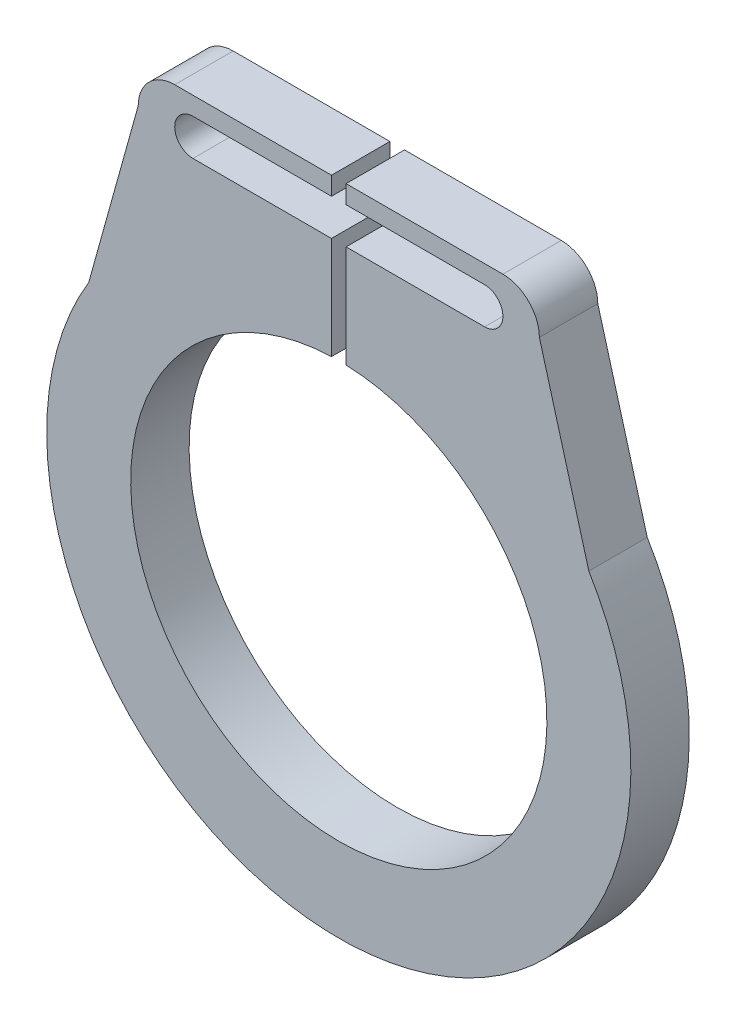
ISO-10303-21;
HEADER;
FILE_DESCRIPTION(('STEP AP214'),'2;1');
FILE_NAME('part.step','',(''),(''),'','','');
FILE_SCHEMA(('AUTOMOTIVE_DESIGN { 1 0 10303 214 1 1 1 1 }'));
ENDSEC;
DATA;
#1=APPLICATION_CONTEXT('core data for automotive mechanical design processes');
#2=APPLICATION_PROTOCOL_DEFINITION('international standard','automotive_design',2000,#1);
#3=PRODUCT_CONTEXT('',#1,'mechanical');
#4=PRODUCT('Part','Part','',(#3));
#5=PRODUCT_RELATED_PRODUCT_CATEGORY('part','',(#4));
#6=PRODUCT_DEFINITION_FORMATION('','',#4);
#7=PRODUCT_DEFINITION_CONTEXT('part definition',#1,'design');
#8=PRODUCT_DEFINITION('design','',#6,#7);
#9=PRODUCT_DEFINITION_SHAPE('','',#8);
#10=(LENGTH_UNIT() NAMED_UNIT(*) SI_UNIT(.MILLI.,.METRE.));
#11=(NAMED_UNIT(*) PLANE_ANGLE_UNIT() SI_UNIT($,.RADIAN.));
#12=(NAMED_UNIT(*) SI_UNIT($,.STERADIAN.) SOLID_ANGLE_UNIT());
#13=UNCERTAINTY_MEASURE_WITH_UNIT(LENGTH_MEASURE(1.E-05),#10,'distance_accuracy_value','');
#14=(GEOMETRIC_REPRESENTATION_CONTEXT(3) GLOBAL_UNCERTAINTY_ASSIGNED_CONTEXT((#13)) GLOBAL_UNIT_ASSIGNED_CONTEXT((#10,
#11,#12)) REPRESENTATION_CONTEXT('',''));
#15=CARTESIAN_POINT('',(0.,0.,0.));
#16=DIRECTION('',(0.,0.,1.));
#17=DIRECTION('',(1.,0.,0.));
#18=AXIS2_PLACEMENT_3D('',#15,#16,#17);
#19=CARTESIAN_POINT('',(-1.85610436769027,0.516802971761623,0.4));
#20=DIRECTION('',(0.9633546511255,-0.268230900820293,0.));
#21=DIRECTION('',(0.268230900820293,0.9633546511255,0.));
#22=AXIS2_PLACEMENT_3D('',#19,#20,#21);
#23=PLANE('',#22);
#24=DIRECTION('',(-0.268230900820293,-0.9633546511255,0.));
#25=VECTOR('',#24,1.);
#26=CARTESIAN_POINT('',(-1.85610436769027,0.516802971761623,0.));
#27=LINE('',#26,#25);
#28=CARTESIAN_POINT('',(-1.37352300511493,2.25,0.));
#29=VERTEX_POINT('',#28);
#30=CARTESIAN_POINT('',(-1.71220873538054,1.03360594352325,0.));
#31=VERTEX_POINT('',#30);
#32=EDGE_CURVE('E192',#29,#31,#27,.T.);
#33=ORIENTED_EDGE('',*,*,#32,.T.);
#34=DIRECTION('',(0.,0.,-1.));
#35=VECTOR('',#34,1.);
#36=CARTESIAN_POINT('',(-1.71220873538054,1.03360594352325,0.4));
#37=LINE('',#36,#35);
#38=CARTESIAN_POINT('',(-1.71220873538054,1.03360594352325,0.4));
#39=VERTEX_POINT('',#38);
#40=EDGE_CURVE('E11',#39,#31,#37,.T.);
#41=ORIENTED_EDGE('',*,*,#40,.F.);
#42=DIRECTION('',(-0.268230900820293,-0.9633546511255,0.));
#43=VECTOR('',#42,1.);
#44=CARTESIAN_POINT('',(-1.85610436769027,0.516802971761623,0.4));
#45=LINE('',#44,#43);
#46=CARTESIAN_POINT('',(-1.37352300511493,2.25,0.4));
#47=VERTEX_POINT('',#46);
#48=EDGE_CURVE('E235',#47,#39,#45,.T.);
#49=ORIENTED_EDGE('',*,*,#48,.F.);
#50=DIRECTION('',(0.,0.,-1.));
#51=VECTOR('',#50,1.);
#52=CARTESIAN_POINT('',(-1.37352300511493,2.25,0.4));
#53=LINE('',#52,#51);
#54=EDGE_CURVE('E187',#47,#29,#53,.T.);
#55=ORIENTED_EDGE('',*,*,#54,.T.);
#56=EDGE_LOOP('',(#33,#41,#49,#55));
#57=FACE_BOUND('',#56,.T.);
#58=ADVANCED_FACE('F35',(#57),#23,.F.);
#59=CARTESIAN_POINT('',(0.,0.,0.4));
#60=DIRECTION('',(0.,0.,-1.));
#61=DIRECTION('',(-1.,0.,0.));
#62=AXIS2_PLACEMENT_3D('',#59,#60,#61);
#63=CYLINDRICAL_SURFACE('',#62,2.);
#64=CARTESIAN_POINT('',(0.,0.,0.));
#65=DIRECTION('',(0.,0.,1.));
#66=DIRECTION('',(1.,0.,0.));
#67=AXIS2_PLACEMENT_3D('',#64,#65,#66);
#68=CIRCLE('',#67,2.);
#69=CARTESIAN_POINT('',(1.71220873538054,1.03360594352325,0.));
#70=VERTEX_POINT('',#69);
#71=EDGE_CURVE('E195',#31,#70,#68,.T.);
#72=ORIENTED_EDGE('',*,*,#71,.T.);
#73=DIRECTION('',(0.,0.,-1.));
#74=VECTOR('',#73,1.);
#75=CARTESIAN_POINT('',(1.71220873538054,1.03360594352325,0.4));
#76=LINE('',#75,#74);
#77=CARTESIAN_POINT('',(1.71220873538054,1.03360594352325,0.4));
#78=VERTEX_POINT('',#77);
#79=EDGE_CURVE('E43',#78,#70,#76,.T.);
#80=ORIENTED_EDGE('',*,*,#79,.F.);
#81=CARTESIAN_POINT('',(0.,0.,0.4));
#82=DIRECTION('',(0.,0.,1.));
#83=DIRECTION('',(1.,0.,0.));
#84=AXIS2_PLACEMENT_3D('',#81,#82,#83);
#85=CIRCLE('',#84,2.);
#86=EDGE_CURVE('E120',#39,#78,#85,.T.);
#87=ORIENTED_EDGE('',*,*,#86,.F.);
#88=ORIENTED_EDGE('',*,*,#40,.T.);
#89=EDGE_LOOP('',(#72,#80,#87,#88));
#90=FACE_BOUND('',#89,.T.);
#91=ADVANCED_FACE('F326',(#90),#63,.T.);
#92=CARTESIAN_POINT('',(1.85610436769027,0.516802971761623,0.4));
#93=DIRECTION('',(-0.9633546511255,-0.268230900820293,0.));
#94=DIRECTION('',(0.268230900820293,-0.9633546511255,0.));
#95=AXIS2_PLACEMENT_3D('',#92,#93,#94);
#96=PLANE('',#95);
#97=DIRECTION('',(-0.268230900820293,0.9633546511255,0.));
#98=VECTOR('',#97,1.);
#99=CARTESIAN_POINT('',(1.85610436769027,0.516802971761623,0.));
#100=LINE('',#99,#98);
#101=CARTESIAN_POINT('',(1.37352300511493,2.25,0.));
#102=VERTEX_POINT('',#101);
#103=EDGE_CURVE('E197',#70,#102,#100,.T.);
#104=ORIENTED_EDGE('',*,*,#103,.T.);
#105=DIRECTION('',(0.,0.,-1.));
#106=VECTOR('',#105,1.);
#107=CARTESIAN_POINT('',(1.37352300511493,2.25,0.4));
#108=LINE('',#107,#106);
#109=CARTESIAN_POINT('',(1.37352300511493,2.25,0.4));
#110=VERTEX_POINT('',#109);
#111=EDGE_CURVE('E262',#110,#102,#108,.T.);
#112=ORIENTED_EDGE('',*,*,#111,.F.);
#113=DIRECTION('',(-0.268230900820293,0.9633546511255,0.));
#114=VECTOR('',#113,1.);
#115=CARTESIAN_POINT('',(1.85610436769027,0.516802971761623,0.4));
#116=LINE('',#115,#114);
#117=EDGE_CURVE('E270',#78,#110,#116,.T.);
#118=ORIENTED_EDGE('',*,*,#117,.F.);
#119=ORIENTED_EDGE('',*,*,#79,.T.);
#120=EDGE_LOOP('',(#104,#112,#118,#119));
#121=FACE_BOUND('',#120,.T.);
#122=ADVANCED_FACE('F268',(#121),#96,.F.);
#123=CARTESIAN_POINT('',(1.12352300511493,2.25,0.4));
#124=DIRECTION('',(0.,0.,-1.));
#125=DIRECTION('',(-1.,0.,0.));
#126=AXIS2_PLACEMENT_3D('',#123,#124,#125);
#127=CYLINDRICAL_SURFACE('',#126,0.25);
#128=CARTESIAN_POINT('',(1.12352300511493,2.25,0.));
#129=DIRECTION('',(0.,0.,1.));
#130=DIRECTION('',(1.,0.,0.));
#131=AXIS2_PLACEMENT_3D('',#128,#129,#130);
#132=CIRCLE('',#131,0.25);
#133=CARTESIAN_POINT('',(1.12352300511493,2.5,0.));
#134=VERTEX_POINT('',#133);
#135=EDGE_CURVE('E199',#102,#134,#132,.T.);
#136=ORIENTED_EDGE('',*,*,#135,.T.);
#137=DIRECTION('',(0.,0.,-1.));
#138=VECTOR('',#137,1.);
#139=CARTESIAN_POINT('',(1.12352300511493,2.5,0.4));
#140=LINE('',#139,#138);
#141=CARTESIAN_POINT('',(1.12352300511493,2.5,0.4));
#142=VERTEX_POINT('',#141);
#143=EDGE_CURVE('E260',#142,#134,#140,.T.);
#144=ORIENTED_EDGE('',*,*,#143,.F.);
#145=CARTESIAN_POINT('',(1.12352300511493,2.25,0.4));
#146=DIRECTION('',(0.,0.,1.));
#147=DIRECTION('',(1.,0.,0.));
#148=AXIS2_PLACEMENT_3D('',#145,#146,#147);
#149=CIRCLE('',#148,0.25);
#150=EDGE_CURVE('E281',#110,#142,#149,.T.);
#151=ORIENTED_EDGE('',*,*,#150,.F.);
#152=ORIENTED_EDGE('',*,*,#111,.T.);
#153=EDGE_LOOP('',(#136,#144,#151,#152));
#154=FACE_BOUND('',#153,.T.);
#155=ADVANCED_FACE('F278',(#154),#127,.T.);
#156=CARTESIAN_POINT('',(0.,2.5,0.4));
#157=DIRECTION('',(0.,1.,0.));
#158=DIRECTION('',(-1.,0.,0.));
#159=AXIS2_PLACEMENT_3D('',#156,#157,#158);
#160=PLANE('',#159);
#161=DIRECTION('',(1.,0.,0.));
#162=VECTOR('',#161,1.);
#163=CARTESIAN_POINT('',(0.,2.5,0.));
#164=LINE('',#163,#162);
#165=CARTESIAN_POINT('',(0.05,2.5,0.));
#166=VERTEX_POINT('',#165);
#167=EDGE_CURVE('E202',#166,#134,#164,.T.);
#168=ORIENTED_EDGE('',*,*,#167,.F.);
#169=DIRECTION('',(0.,0.,-1.));
#170=VECTOR('',#169,1.);
#171=CARTESIAN_POINT('',(0.05,2.5,0.4));
#172=LINE('',#171,#170);
#173=CARTESIAN_POINT('',(0.05,2.5,0.4));
#174=VERTEX_POINT('',#173);
#175=EDGE_CURVE('E258',#174,#166,#172,.T.);
#176=ORIENTED_EDGE('',*,*,#175,.F.);
#177=DIRECTION('',(1.,0.,0.));
#178=VECTOR('',#177,1.);
#179=CARTESIAN_POINT('',(0.,2.5,0.4));
#180=LINE('',#179,#178);
#181=EDGE_CURVE('E283',#174,#142,#180,.T.);
#182=ORIENTED_EDGE('',*,*,#181,.T.);
#183=ORIENTED_EDGE('',*,*,#143,.T.);
#184=EDGE_LOOP('',(#168,#176,#182,#183));
#185=FACE_BOUND('',#184,.T.);
#186=ADVANCED_FACE('F337',(#185),#160,.T.);
#187=CARTESIAN_POINT('',(0.0500000000000001,0.,0.4));
#188=DIRECTION('',(-1.,0.,0.));
#189=DIRECTION('',(0.,-1.,0.));
#190=AXIS2_PLACEMENT_3D('',#187,#188,#189);
#191=PLANE('',#190);
#192=DIRECTION('',(0.,1.,0.));
#193=VECTOR('',#192,1.);
#194=CARTESIAN_POINT('',(0.0500000000000001,0.,0.));
#195=LINE('',#194,#193);
#196=CARTESIAN_POINT('',(0.05,2.375,0.));
#197=VERTEX_POINT('',#196);
#198=EDGE_CURVE('E205',#197,#166,#195,.T.);
#199=ORIENTED_EDGE('',*,*,#198,.F.);
#200=DIRECTION('',(0.,0.,-1.));
#201=VECTOR('',#200,1.);
#202=CARTESIAN_POINT('',(0.05,2.375,0.4));
#203=LINE('',#202,#201);
#204=CARTESIAN_POINT('',(0.05,2.375,0.4));
#205=VERTEX_POINT('',#204);
#206=EDGE_CURVE('E256',#205,#197,#203,.T.);
#207=ORIENTED_EDGE('',*,*,#206,.F.);
#208=DIRECTION('',(0.,1.,0.));
#209=VECTOR('',#208,1.);
#210=CARTESIAN_POINT('',(0.0500000000000001,0.,0.4));
#211=LINE('',#210,#209);
#212=EDGE_CURVE('E285',#205,#174,#211,.T.);
#213=ORIENTED_EDGE('',*,*,#212,.T.);
#214=ORIENTED_EDGE('',*,*,#175,.T.);
#215=EDGE_LOOP('',(#199,#207,#213,#214));
#216=FACE_BOUND('',#215,.T.);
#217=ADVANCED_FACE('F340',(#216),#191,.T.);
#218=CARTESIAN_POINT('',(0.,2.375,0.4));
#219=DIRECTION('',(0.,-1.,0.));
#220=DIRECTION('',(0.,0.,-1.));
#221=AXIS2_PLACEMENT_3D('',#218,#219,#220);
#222=PLANE('',#221);
#223=DIRECTION('',(-1.,0.,0.));
#224=VECTOR('',#223,1.);
#225=CARTESIAN_POINT('',(0.,2.375,0.));
#226=LINE('',#225,#224);
#227=CARTESIAN_POINT('',(0.998523005114928,2.375,0.));
#228=VERTEX_POINT('',#227);
#229=EDGE_CURVE('E208',#228,#197,#226,.T.);
#230=ORIENTED_EDGE('',*,*,#229,.F.);
#231=DIRECTION('',(0.,0.,-1.));
#232=VECTOR('',#231,1.);
#233=CARTESIAN_POINT('',(0.998523005114928,2.375,0.4));
#234=LINE('',#233,#232);
#235=CARTESIAN_POINT('',(0.998523005114928,2.375,0.4));
#236=VERTEX_POINT('',#235);
#237=EDGE_CURVE('E254',#236,#228,#234,.T.);
#238=ORIENTED_EDGE('',*,*,#237,.F.);
#239=DIRECTION('',(-1.,0.,0.));
#240=VECTOR('',#239,1.);
#241=CARTESIAN_POINT('',(0.,2.375,0.4));
#242=LINE('',#241,#240);
#243=EDGE_CURVE('E292',#236,#205,#242,.T.);
#244=ORIENTED_EDGE('',*,*,#243,.T.);
#245=ORIENTED_EDGE('',*,*,#206,.T.);
#246=EDGE_LOOP('',(#230,#238,#244,#245));
#247=FACE_BOUND('',#246,.T.);
#248=ADVANCED_FACE('F342',(#247),#222,.T.);
#249=CARTESIAN_POINT('',(0.998523005114928,2.25,0.4));
#250=DIRECTION('',(0.,0.,-1.));
#251=DIRECTION('',(-1.,0.,0.));
#252=AXIS2_PLACEMENT_3D('',#249,#250,#251);
#253=CYLINDRICAL_SURFACE('',#252,0.125000000000002);
#254=CARTESIAN_POINT('',(0.998523005114928,2.25,0.));
#255=DIRECTION('',(0.,0.,1.));
#256=DIRECTION('',(1.,0.,0.));
#257=AXIS2_PLACEMENT_3D('',#254,#255,#256);
#258=CIRCLE('',#257,0.125000000000002);
#259=CARTESIAN_POINT('',(0.998523005114928,2.125,0.));
#260=VERTEX_POINT('',#259);
#261=EDGE_CURVE('E212',#260,#228,#258,.T.);
#262=ORIENTED_EDGE('',*,*,#261,.F.);
#263=DIRECTION('',(0.,0.,-1.));
#264=VECTOR('',#263,1.);
#265=CARTESIAN_POINT('',(0.998523005114928,2.125,0.4));
#266=LINE('',#265,#264);
#267=CARTESIAN_POINT('',(0.998523005114928,2.125,0.4));
#268=VERTEX_POINT('',#267);
#269=EDGE_CURVE('E252',#268,#260,#266,.T.);
#270=ORIENTED_EDGE('',*,*,#269,.F.);
#271=CARTESIAN_POINT('',(0.998523005114928,2.25,0.4));
#272=DIRECTION('',(0.,0.,1.));
#273=DIRECTION('',(1.,0.,0.));
#274=AXIS2_PLACEMENT_3D('',#271,#272,#273);
#275=CIRCLE('',#274,0.125000000000002);
#276=EDGE_CURVE('E296',#268,#236,#275,.T.);
#277=ORIENTED_EDGE('',*,*,#276,.T.);
#278=ORIENTED_EDGE('',*,*,#237,.T.);
#279=EDGE_LOOP('',(#262,#270,#277,#278));
#280=FACE_BOUND('',#279,.T.);
#281=ADVANCED_FACE('F345',(#280),#253,.F.);
#282=CARTESIAN_POINT('',(0.,2.125,0.4));
#283=DIRECTION('',(0.,-1.,0.));
#284=DIRECTION('',(0.,0.,-1.));
#285=AXIS2_PLACEMENT_3D('',#282,#283,#284);
#286=PLANE('',#285);
#287=DIRECTION('',(-1.,0.,0.));
#288=VECTOR('',#287,1.);
#289=CARTESIAN_POINT('',(0.,2.125,0.));
#290=LINE('',#289,#288);
#291=CARTESIAN_POINT('',(0.05,2.125,0.));
#292=VERTEX_POINT('',#291);
#293=EDGE_CURVE('E215',#260,#292,#290,.T.);
#294=ORIENTED_EDGE('',*,*,#293,.T.);
#295=DIRECTION('',(0.,0.,-1.));
#296=VECTOR('',#295,1.);
#297=CARTESIAN_POINT('',(0.05,2.125,0.4));
#298=LINE('',#297,#296);
#299=CARTESIAN_POINT('',(0.05,2.125,0.4));
#300=VERTEX_POINT('',#299);
#301=EDGE_CURVE('E250',#300,#292,#298,.T.);
#302=ORIENTED_EDGE('',*,*,#301,.F.);
#303=DIRECTION('',(-1.,0.,0.));
#304=VECTOR('',#303,1.);
#305=CARTESIAN_POINT('',(0.,2.125,0.4));
#306=LINE('',#305,#304);
#307=EDGE_CURVE('E299',#268,#300,#306,.T.);
#308=ORIENTED_EDGE('',*,*,#307,.F.);
#309=ORIENTED_EDGE('',*,*,#269,.T.);
#310=EDGE_LOOP('',(#294,#302,#308,#309));
#311=FACE_BOUND('',#310,.T.);
#312=ADVANCED_FACE('F349',(#311),#286,.F.);
#313=CARTESIAN_POINT('',(0.05,1.42412253686261,0.));
#314=VERTEX_POINT('',#313);
#315=EDGE_CURVE('E209',#314,#292,#195,.T.);
#316=ORIENTED_EDGE('',*,*,#315,.F.);
#317=DIRECTION('',(0.,0.,-1.));
#318=VECTOR('',#317,1.);
#319=CARTESIAN_POINT('',(0.05,1.42412253686261,0.4));
#320=LINE('',#319,#318);
#321=CARTESIAN_POINT('',(0.05,1.42412253686261,0.4));
#322=VERTEX_POINT('',#321);
#323=EDGE_CURVE('E248',#322,#314,#320,.T.);
#324=ORIENTED_EDGE('',*,*,#323,.F.);
#325=EDGE_CURVE('E293',#322,#300,#211,.T.);
#326=ORIENTED_EDGE('',*,*,#325,.T.);
#327=ORIENTED_EDGE('',*,*,#301,.T.);
#328=EDGE_LOOP('',(#316,#324,#326,#327));
#329=FACE_BOUND('',#328,.T.);
#330=ADVANCED_FACE('F353',(#329),#191,.T.);
#331=CARTESIAN_POINT('',(0.,0.,0.4));
#332=DIRECTION('',(0.,0.,-1.));
#333=DIRECTION('',(-1.,0.,0.));
#334=AXIS2_PLACEMENT_3D('',#331,#332,#333);
#335=CYLINDRICAL_SURFACE('',#334,1.425);
#336=CARTESIAN_POINT('',(0.,0.,0.));
#337=DIRECTION('',(0.,0.,1.));
#338=DIRECTION('',(1.,0.,0.));
#339=AXIS2_PLACEMENT_3D('',#336,#337,#338);
#340=CIRCLE('',#339,1.425);
#341=CARTESIAN_POINT('',(-0.0499999999999997,1.42412253686261,0.));
#342=VERTEX_POINT('',#341);
#343=EDGE_CURVE('E218',#342,#314,#340,.T.);
#344=ORIENTED_EDGE('',*,*,#343,.F.);
#345=DIRECTION('',(0.,0.,-1.));
#346=VECTOR('',#345,1.);
#347=CARTESIAN_POINT('',(-0.0499999999999997,1.42412253686261,0.4));
#348=LINE('',#347,#346);
#349=CARTESIAN_POINT('',(-0.0499999999999997,1.42412253686261,0.4));
#350=VERTEX_POINT('',#349);
#351=EDGE_CURVE('E246',#350,#342,#348,.T.);
#352=ORIENTED_EDGE('',*,*,#351,.F.);
#353=CARTESIAN_POINT('',(0.,0.,0.4));
#354=DIRECTION('',(0.,0.,1.));
#355=DIRECTION('',(1.,0.,0.));
#356=AXIS2_PLACEMENT_3D('',#353,#354,#355);
#357=CIRCLE('',#356,1.425);
#358=EDGE_CURVE('E301',#350,#322,#357,.T.);
#359=ORIENTED_EDGE('',*,*,#358,.T.);
#360=ORIENTED_EDGE('',*,*,#323,.T.);
#361=EDGE_LOOP('',(#344,#352,#359,#360));
#362=FACE_BOUND('',#361,.T.);
#363=ADVANCED_FACE('F357',(#362),#335,.F.);
#364=CARTESIAN_POINT('',(-0.0499999999999997,0.,0.4));
#365=DIRECTION('',(-1.,0.,0.));
#366=DIRECTION('',(0.,0.,1.));
#367=AXIS2_PLACEMENT_3D('',#364,#365,#366);
#368=PLANE('',#367);
#369=DIRECTION('',(0.,1.,0.));
#370=VECTOR('',#369,1.);
#371=CARTESIAN_POINT('',(-0.0499999999999997,0.,0.));
#372=LINE('',#371,#370);
#373=CARTESIAN_POINT('',(-0.0499999999999997,2.125,0.));
#374=VERTEX_POINT('',#373);
#375=EDGE_CURVE('E221',#342,#374,#372,.T.);
#376=ORIENTED_EDGE('',*,*,#375,.T.);
#377=DIRECTION('',(0.,0.,-1.));
#378=VECTOR('',#377,1.);
#379=CARTESIAN_POINT('',(-0.0499999999999997,2.125,0.4));
#380=LINE('',#379,#378);
#381=CARTESIAN_POINT('',(-0.0499999999999997,2.125,0.4));
#382=VERTEX_POINT('',#381);
#383=EDGE_CURVE('E243',#382,#374,#380,.T.);
#384=ORIENTED_EDGE('',*,*,#383,.F.);
#385=DIRECTION('',(0.,1.,0.));
#386=VECTOR('',#385,1.);
#387=CARTESIAN_POINT('',(-0.0499999999999997,0.,0.4));
#388=LINE('',#387,#386);
#389=EDGE_CURVE('E174',#350,#382,#388,.T.);
#390=ORIENTED_EDGE('',*,*,#389,.F.);
#391=ORIENTED_EDGE('',*,*,#351,.T.);
#392=EDGE_LOOP('',(#376,#384,#390,#391));
#393=FACE_BOUND('',#392,.T.);
#394=ADVANCED_FACE('F361',(#393),#368,.F.);
#395=CARTESIAN_POINT('',(0.,2.125,0.4));
#396=DIRECTION('',(0.,-1.,0.));
#397=DIRECTION('',(0.,0.,-1.));
#398=AXIS2_PLACEMENT_3D('',#395,#396,#397);
#399=PLANE('',#398);
#400=DIRECTION('',(-1.,0.,0.));
#401=VECTOR('',#400,1.);
#402=CARTESIAN_POINT('',(0.,2.125,0.));
#403=LINE('',#402,#401);
#404=CARTESIAN_POINT('',(-0.998523005114928,2.125,0.));
#405=VERTEX_POINT('',#404);
#406=EDGE_CURVE('E223',#374,#405,#403,.T.);
#407=ORIENTED_EDGE('',*,*,#406,.T.);
#408=DIRECTION('',(0.,0.,-1.));
#409=VECTOR('',#408,1.);
#410=CARTESIAN_POINT('',(-0.998523005114928,2.125,0.4));
#411=LINE('',#410,#409);
#412=CARTESIAN_POINT('',(-0.998523005114928,2.125,0.4));
#413=VERTEX_POINT('',#412);
#414=EDGE_CURVE('E241',#413,#405,#411,.T.);
#415=ORIENTED_EDGE('',*,*,#414,.F.);
#416=DIRECTION('',(-1.,0.,0.));
#417=VECTOR('',#416,1.);
#418=CARTESIAN_POINT('',(0.,2.125,0.4));
#419=LINE('',#418,#417);
#420=EDGE_CURVE('E304',#382,#413,#419,.T.);
#421=ORIENTED_EDGE('',*,*,#420,.F.);
#422=ORIENTED_EDGE('',*,*,#383,.T.);
#423=EDGE_LOOP('',(#407,#415,#421,#422));
#424=FACE_BOUND('',#423,.T.);
#425=ADVANCED_FACE('F363',(#424),#399,.F.);
#426=CARTESIAN_POINT('',(-0.998523005114928,2.25,0.4));
#427=DIRECTION('',(0.,0.,-1.));
#428=DIRECTION('',(-1.,0.,0.));
#429=AXIS2_PLACEMENT_3D('',#426,#427,#428);
#430=CYLINDRICAL_SURFACE('',#429,0.125000000000002);
#431=CARTESIAN_POINT('',(-0.998523005114928,2.25,0.));
#432=DIRECTION('',(0.,0.,1.));
#433=DIRECTION('',(1.,0.,0.));
#434=AXIS2_PLACEMENT_3D('',#431,#432,#433);
#435=CIRCLE('',#434,0.125000000000002);
#436=CARTESIAN_POINT('',(-0.998523005114928,2.375,0.));
#437=VERTEX_POINT('',#436);
#438=EDGE_CURVE('E226',#437,#405,#435,.T.);
#439=ORIENTED_EDGE('',*,*,#438,.F.);
#440=DIRECTION('',(0.,0.,-1.));
#441=VECTOR('',#440,1.);
#442=CARTESIAN_POINT('',(-0.998523005114928,2.375,0.4));
#443=LINE('',#442,#441);
#444=CARTESIAN_POINT('',(-0.998523005114928,2.375,0.4));
#445=VERTEX_POINT('',#444);
#446=EDGE_CURVE('E239',#445,#437,#443,.T.);
#447=ORIENTED_EDGE('',*,*,#446,.F.);
#448=CARTESIAN_POINT('',(-0.998523005114928,2.25,0.4));
#449=DIRECTION('',(0.,0.,1.));
#450=DIRECTION('',(1.,0.,0.));
#451=AXIS2_PLACEMENT_3D('',#448,#449,#450);
#452=CIRCLE('',#451,0.125000000000002);
#453=EDGE_CURVE('E305',#445,#413,#452,.T.);
#454=ORIENTED_EDGE('',*,*,#453,.T.);
#455=ORIENTED_EDGE('',*,*,#414,.T.);
#456=EDGE_LOOP('',(#439,#447,#454,#455));
#457=FACE_BOUND('',#456,.T.);
#458=ADVANCED_FACE('F366',(#457),#430,.F.);
#459=CARTESIAN_POINT('',(0.,2.375,0.4));
#460=DIRECTION('',(0.,-1.,0.));
#461=DIRECTION('',(0.,0.,-1.));
#462=AXIS2_PLACEMENT_3D('',#459,#460,#461);
#463=PLANE('',#462);
#464=DIRECTION('',(-1.,0.,0.));
#465=VECTOR('',#464,1.);
#466=CARTESIAN_POINT('',(0.,2.375,0.));
#467=LINE('',#466,#465);
#468=CARTESIAN_POINT('',(-0.0499999999999997,2.375,0.));
#469=VERTEX_POINT('',#468);
#470=EDGE_CURVE('E229',#469,#437,#467,.T.);
#471=ORIENTED_EDGE('',*,*,#470,.F.);
#472=DIRECTION('',(0.,0.,-1.));
#473=VECTOR('',#472,1.);
#474=CARTESIAN_POINT('',(-0.0499999999999997,2.375,0.4));
#475=LINE('',#474,#473);
#476=CARTESIAN_POINT('',(-0.0499999999999997,2.375,0.4));
#477=VERTEX_POINT('',#476);
#478=EDGE_CURVE('E183',#477,#469,#475,.T.);
#479=ORIENTED_EDGE('',*,*,#478,.F.);
#480=DIRECTION('',(-1.,0.,0.));
#481=VECTOR('',#480,1.);
#482=CARTESIAN_POINT('',(0.,2.375,0.4));
#483=LINE('',#482,#481);
#484=EDGE_CURVE('E171',#477,#445,#483,.T.);
#485=ORIENTED_EDGE('',*,*,#484,.T.);
#486=ORIENTED_EDGE('',*,*,#446,.T.);
#487=EDGE_LOOP('',(#471,#479,#485,#486));
#488=FACE_BOUND('',#487,.T.);
#489=ADVANCED_FACE('F310',(#488),#463,.T.);
#490=CARTESIAN_POINT('',(-0.0499999999999997,2.5,0.));
#491=VERTEX_POINT('',#490);
#492=EDGE_CURVE('E179',#469,#491,#372,.T.);
#493=ORIENTED_EDGE('',*,*,#492,.T.);
#494=DIRECTION('',(0.,0.,-1.));
#495=VECTOR('',#494,1.);
#496=CARTESIAN_POINT('',(-0.0499999999999997,2.5,0.4));
#497=LINE('',#496,#495);
#498=CARTESIAN_POINT('',(-0.0499999999999997,2.5,0.4));
#499=VERTEX_POINT('',#498);
#500=EDGE_CURVE('E176',#499,#491,#497,.T.);
#501=ORIENTED_EDGE('',*,*,#500,.F.);
#502=EDGE_CURVE('E164',#477,#499,#388,.T.);
#503=ORIENTED_EDGE('',*,*,#502,.F.);
#504=ORIENTED_EDGE('',*,*,#478,.T.);
#505=EDGE_LOOP('',(#493,#501,#503,#504));
#506=FACE_BOUND('',#505,.T.);
#507=ADVANCED_FACE('F177',(#506),#368,.F.);
#508=CARTESIAN_POINT('',(0.,2.5,0.4));
#509=DIRECTION('',(0.,1.,0.));
#510=DIRECTION('',(0.,0.,1.));
#511=AXIS2_PLACEMENT_3D('',#508,#509,#510);
#512=PLANE('',#511);
#513=DIRECTION('',(1.,0.,0.));
#514=VECTOR('',#513,1.);
#515=CARTESIAN_POINT('',(0.,2.5,0.));
#516=LINE('',#515,#514);
#517=CARTESIAN_POINT('',(-1.12352300511493,2.5,0.));
#518=VERTEX_POINT('',#517);
#519=EDGE_CURVE('E232',#518,#491,#516,.T.);
#520=ORIENTED_EDGE('',*,*,#519,.F.);
#521=DIRECTION('',(0.,0.,-1.));
#522=VECTOR('',#521,1.);
#523=CARTESIAN_POINT('',(-1.12352300511493,2.5,0.4));
#524=LINE('',#523,#522);
#525=CARTESIAN_POINT('',(-1.12352300511493,2.5,0.4));
#526=VERTEX_POINT('',#525);
#527=EDGE_CURVE('E109',#526,#518,#524,.T.);
#528=ORIENTED_EDGE('',*,*,#527,.F.);
#529=DIRECTION('',(1.,0.,0.));
#530=VECTOR('',#529,1.);
#531=CARTESIAN_POINT('',(0.,2.5,0.4));
#532=LINE('',#531,#530);
#533=EDGE_CURVE('E168',#526,#499,#532,.T.);
#534=ORIENTED_EDGE('',*,*,#533,.T.);
#535=ORIENTED_EDGE('',*,*,#500,.T.);
#536=EDGE_LOOP('',(#520,#528,#534,#535));
#537=FACE_BOUND('',#536,.T.);
#538=ADVANCED_FACE('F185',(#537),#512,.T.);
#539=CARTESIAN_POINT('',(-1.12352300511493,2.25,0.4));
#540=DIRECTION('',(0.,0.,-1.));
#541=DIRECTION('',(-1.,0.,0.));
#542=AXIS2_PLACEMENT_3D('',#539,#540,#541);
#543=CYLINDRICAL_SURFACE('',#542,0.25);
#544=CARTESIAN_POINT('',(-1.12352300511493,2.25,0.));
#545=DIRECTION('',(0.,0.,1.));
#546=DIRECTION('',(1.,0.,0.));
#547=AXIS2_PLACEMENT_3D('',#544,#545,#546);
#548=CIRCLE('',#547,0.25);
#549=EDGE_CURVE('E112',#518,#29,#548,.T.);
#550=ORIENTED_EDGE('',*,*,#549,.T.);
#551=ORIENTED_EDGE('',*,*,#54,.F.);
#552=CARTESIAN_POINT('',(-1.12352300511493,2.25,0.4));
#553=DIRECTION('',(0.,0.,1.));
#554=DIRECTION('',(1.,0.,0.));
#555=AXIS2_PLACEMENT_3D('',#552,#553,#554);
#556=CIRCLE('',#555,0.25);
#557=EDGE_CURVE('E51',#526,#47,#556,.T.);
#558=ORIENTED_EDGE('',*,*,#557,.F.);
#559=ORIENTED_EDGE('',*,*,#527,.T.);
#560=EDGE_LOOP('',(#550,#551,#558,#559));
#561=FACE_BOUND('',#560,.T.);
#562=ADVANCED_FACE('F315',(#561),#543,.T.);
#563=CARTESIAN_POINT('',(0.,0.,0.4));
#564=DIRECTION('',(0.,0.,1.));
#565=DIRECTION('',(1.,0.,0.));
#566=AXIS2_PLACEMENT_3D('',#563,#564,#565);
#567=PLANE('',#566);
#568=ORIENTED_EDGE('',*,*,#48,.T.);
#569=ORIENTED_EDGE('',*,*,#86,.T.);
#570=ORIENTED_EDGE('',*,*,#117,.T.);
#571=ORIENTED_EDGE('',*,*,#150,.T.);
#572=ORIENTED_EDGE('',*,*,#181,.F.);
#573=ORIENTED_EDGE('',*,*,#212,.F.);
#574=ORIENTED_EDGE('',*,*,#243,.F.);
#575=ORIENTED_EDGE('',*,*,#276,.F.);
#576=ORIENTED_EDGE('',*,*,#307,.T.);
#577=ORIENTED_EDGE('',*,*,#325,.F.);
#578=ORIENTED_EDGE('',*,*,#358,.F.);
#579=ORIENTED_EDGE('',*,*,#389,.T.);
#580=ORIENTED_EDGE('',*,*,#420,.T.);
#581=ORIENTED_EDGE('',*,*,#453,.F.);
#582=ORIENTED_EDGE('',*,*,#484,.F.);
#583=ORIENTED_EDGE('',*,*,#502,.T.);
#584=ORIENTED_EDGE('',*,*,#533,.F.);
#585=ORIENTED_EDGE('',*,*,#557,.T.);
#586=EDGE_LOOP('',(#568,#569,#570,#571,#572,#573,#574,#575,#576,#577,#578,#579,#580,#581,#582,
#583,#584,#585));
#587=FACE_BOUND('',#586,.T.);
#588=ADVANCED_FACE('F166',(#587),#567,.T.);
#589=CARTESIAN_POINT('',(0.,0.,0.));
#590=DIRECTION('',(0.,0.,1.));
#591=DIRECTION('',(1.,0.,0.));
#592=AXIS2_PLACEMENT_3D('',#589,#590,#591);
#593=PLANE('',#592);
#594=ORIENTED_EDGE('',*,*,#32,.F.);
#595=ORIENTED_EDGE('',*,*,#549,.F.);
#596=ORIENTED_EDGE('',*,*,#519,.T.);
#597=ORIENTED_EDGE('',*,*,#492,.F.);
#598=ORIENTED_EDGE('',*,*,#470,.T.);
#599=ORIENTED_EDGE('',*,*,#438,.T.);
#600=ORIENTED_EDGE('',*,*,#406,.F.);
#601=ORIENTED_EDGE('',*,*,#375,.F.);
#602=ORIENTED_EDGE('',*,*,#343,.T.);
#603=ORIENTED_EDGE('',*,*,#315,.T.);
#604=ORIENTED_EDGE('',*,*,#293,.F.);
#605=ORIENTED_EDGE('',*,*,#261,.T.);
#606=ORIENTED_EDGE('',*,*,#229,.T.);
#607=ORIENTED_EDGE('',*,*,#198,.T.);
#608=ORIENTED_EDGE('',*,*,#167,.T.);
#609=ORIENTED_EDGE('',*,*,#135,.F.);
#610=ORIENTED_EDGE('',*,*,#103,.F.);
#611=ORIENTED_EDGE('',*,*,#71,.F.);
#612=EDGE_LOOP('',(#594,#595,#596,#597,#598,#599,#600,#601,#602,#603,#604,#605,#606,#607,#608,
#609,#610,#611));
#613=FACE_BOUND('',#612,.T.);
#614=ADVANCED_FACE('F274',(#613),#593,.F.);
#615=CLOSED_SHELL('',(#58,#91,#122,#155,#186,#217,#248,#281,#312,#330,#363,#394,#425,#458,#489,
#507,#538,#562,#588,#614));
#616=MANIFOLD_SOLID_BREP('B2',#615);
#617=ADVANCED_BREP_SHAPE_REPRESENTATION('',(#18,#616),#14);
#618=SHAPE_DEFINITION_REPRESENTATION(#9,#617);
ENDSEC;
END-ISO-10303-21;
